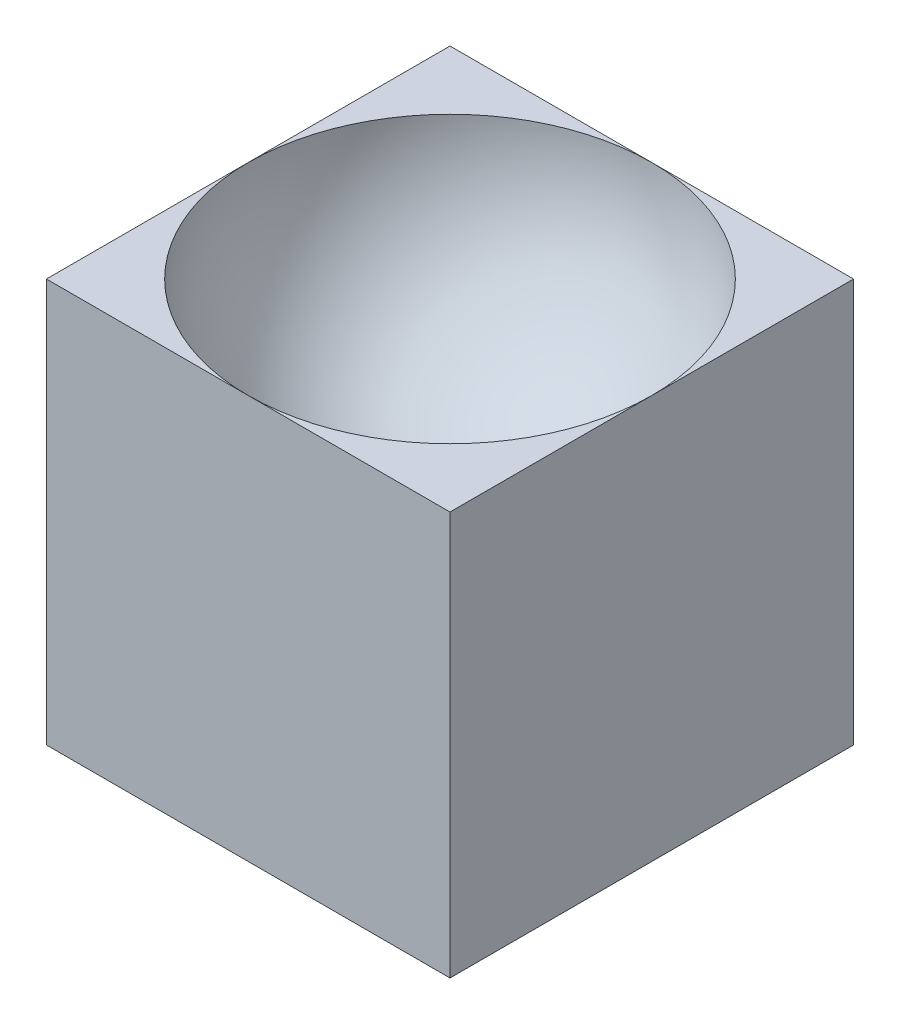
ISO-10303-21;
HEADER;
FILE_DESCRIPTION(('STEP AP214'),'2;1');
FILE_NAME('part.step','',(''),(''),'','','');
FILE_SCHEMA(('AUTOMOTIVE_DESIGN { 1 0 10303 214 1 1 1 1 }'));
ENDSEC;
DATA;
#1=APPLICATION_CONTEXT('core data for automotive mechanical design processes');
#2=APPLICATION_PROTOCOL_DEFINITION('international standard','automotive_design',2000,#1);
#3=PRODUCT_CONTEXT('',#1,'mechanical');
#4=PRODUCT('Part','Part','',(#3));
#5=PRODUCT_RELATED_PRODUCT_CATEGORY('part','',(#4));
#6=PRODUCT_DEFINITION_FORMATION('','',#4);
#7=PRODUCT_DEFINITION_CONTEXT('part definition',#1,'design');
#8=PRODUCT_DEFINITION('design','',#6,#7);
#9=PRODUCT_DEFINITION_SHAPE('','',#8);
#10=(LENGTH_UNIT() NAMED_UNIT(*) SI_UNIT(.MILLI.,.METRE.));
#11=(NAMED_UNIT(*) PLANE_ANGLE_UNIT() SI_UNIT($,.RADIAN.));
#12=(NAMED_UNIT(*) SI_UNIT($,.STERADIAN.) SOLID_ANGLE_UNIT());
#13=UNCERTAINTY_MEASURE_WITH_UNIT(LENGTH_MEASURE(1.E-05),#10,'distance_accuracy_value','');
#14=(GEOMETRIC_REPRESENTATION_CONTEXT(3) GLOBAL_UNCERTAINTY_ASSIGNED_CONTEXT((#13)) GLOBAL_UNIT_ASSIGNED_CONTEXT((#10,
#11,#12)) REPRESENTATION_CONTEXT('',''));
#15=CARTESIAN_POINT('',(0.,0.,0.));
#16=DIRECTION('',(0.,0.,1.));
#17=DIRECTION('',(1.,0.,0.));
#18=AXIS2_PLACEMENT_3D('',#15,#16,#17);
#19=CARTESIAN_POINT('',(0.,2.,0.));
#20=DIRECTION('',(0.,1.,0.));
#21=DIRECTION('',(0.,0.,1.));
#22=AXIS2_PLACEMENT_3D('',#19,#20,#21);
#23=PLANE('',#22);
#24=DIRECTION('',(1.,0.,0.));
#25=VECTOR('',#24,1.);
#26=CARTESIAN_POINT('',(-1.,2.,1.));
#27=LINE('',#26,#25);
#28=CARTESIAN_POINT('',(-1.,2.,1.));
#29=VERTEX_POINT('',#28);
#30=CARTESIAN_POINT('',(0.,2.,1.));
#31=VERTEX_POINT('',#30);
#32=EDGE_CURVE('E119',#29,#31,#27,.T.);
#33=ORIENTED_EDGE('',*,*,#32,.T.);
#34=CARTESIAN_POINT('',(0.,2.,0.));
#35=DIRECTION('',(0.,1.,0.));
#36=DIRECTION('',(0.,0.,1.));
#37=AXIS2_PLACEMENT_3D('',#34,#35,#36);
#38=CIRCLE('',#37,1.);
#39=CARTESIAN_POINT('',(-1.,2.,0.));
#40=VERTEX_POINT('',#39);
#41=EDGE_CURVE('E11',#31,#40,#38,.F.);
#42=ORIENTED_EDGE('',*,*,#41,.T.);
#43=DIRECTION('',(0.,0.,1.));
#44=VECTOR('',#43,1.);
#45=CARTESIAN_POINT('',(-1.,2.,-1.));
#46=LINE('',#45,#44);
#47=EDGE_CURVE('E115',#40,#29,#46,.T.);
#48=ORIENTED_EDGE('',*,*,#47,.T.);
#49=EDGE_LOOP('',(#33,#42,#48));
#50=FACE_BOUND('',#49,.T.);
#51=ADVANCED_FACE('F37',(#50),#23,.T.);
#52=CARTESIAN_POINT('',(-1.,2.,-1.));
#53=VERTEX_POINT('',#52);
#54=EDGE_CURVE('E116',#53,#40,#46,.T.);
#55=ORIENTED_EDGE('',*,*,#54,.T.);
#56=CARTESIAN_POINT('',(0.,2.,-1.));
#57=VERTEX_POINT('',#56);
#58=EDGE_CURVE('E46',#40,#57,#38,.F.);
#59=ORIENTED_EDGE('',*,*,#58,.T.);
#60=DIRECTION('',(-1.,0.,0.));
#61=VECTOR('',#60,1.);
#62=CARTESIAN_POINT('',(-1.,2.,-1.));
#63=LINE('',#62,#61);
#64=EDGE_CURVE('E112',#57,#53,#63,.T.);
#65=ORIENTED_EDGE('',*,*,#64,.T.);
#66=EDGE_LOOP('',(#55,#59,#65));
#67=FACE_BOUND('',#66,.T.);
#68=ADVANCED_FACE('F152',(#67),#23,.T.);
#69=CARTESIAN_POINT('',(1.,2.,-1.));
#70=VERTEX_POINT('',#69);
#71=EDGE_CURVE('E103',#70,#57,#63,.T.);
#72=ORIENTED_EDGE('',*,*,#71,.T.);
#73=CARTESIAN_POINT('',(1.,2.,0.));
#74=VERTEX_POINT('',#73);
#75=EDGE_CURVE('E99',#57,#74,#38,.F.);
#76=ORIENTED_EDGE('',*,*,#75,.T.);
#77=DIRECTION('',(0.,0.,-1.));
#78=VECTOR('',#77,1.);
#79=CARTESIAN_POINT('',(1.,2.,-1.));
#80=LINE('',#79,#78);
#81=EDGE_CURVE('E89',#74,#70,#80,.T.);
#82=ORIENTED_EDGE('',*,*,#81,.T.);
#83=EDGE_LOOP('',(#72,#76,#82));
#84=FACE_BOUND('',#83,.T.);
#85=ADVANCED_FACE('F102',(#84),#23,.T.);
#86=CARTESIAN_POINT('',(1.,2.,-1.));
#87=DIRECTION('',(-1.,0.,0.));
#88=DIRECTION('',(0.,0.,1.));
#89=AXIS2_PLACEMENT_3D('',#86,#87,#88);
#90=PLANE('',#89);
#91=DIRECTION('',(0.,0.,-1.));
#92=VECTOR('',#91,1.);
#93=CARTESIAN_POINT('',(1.,0.,-1.));
#94=LINE('',#93,#92);
#95=CARTESIAN_POINT('',(1.,0.,1.));
#96=VERTEX_POINT('',#95);
#97=CARTESIAN_POINT('',(1.,0.,-1.));
#98=VERTEX_POINT('',#97);
#99=EDGE_CURVE('E123',#96,#98,#94,.T.);
#100=ORIENTED_EDGE('',*,*,#99,.T.);
#101=DIRECTION('',(0.,-1.,0.));
#102=VECTOR('',#101,1.);
#103=CARTESIAN_POINT('',(1.,2.,-1.));
#104=LINE('',#103,#102);
#105=EDGE_CURVE('E101',#70,#98,#104,.T.);
#106=ORIENTED_EDGE('',*,*,#105,.F.);
#107=ORIENTED_EDGE('',*,*,#81,.F.);
#108=CARTESIAN_POINT('',(1.,2.,1.));
#109=VERTEX_POINT('',#108);
#110=EDGE_CURVE('E108',#109,#74,#80,.T.);
#111=ORIENTED_EDGE('',*,*,#110,.F.);
#112=DIRECTION('',(0.,-1.,0.));
#113=VECTOR('',#112,1.);
#114=CARTESIAN_POINT('',(1.,2.,1.));
#115=LINE('',#114,#113);
#116=EDGE_CURVE('E122',#109,#96,#115,.T.);
#117=ORIENTED_EDGE('',*,*,#116,.T.);
#118=EDGE_LOOP('',(#100,#106,#107,#111,#117));
#119=FACE_BOUND('',#118,.T.);
#120=ADVANCED_FACE('F39',(#119),#90,.F.);
#121=CARTESIAN_POINT('',(-1.,2.,-1.));
#122=DIRECTION('',(0.,0.,1.));
#123=DIRECTION('',(1.,0.,0.));
#124=AXIS2_PLACEMENT_3D('',#121,#122,#123);
#125=PLANE('',#124);
#126=DIRECTION('',(-1.,0.,0.));
#127=VECTOR('',#126,1.);
#128=CARTESIAN_POINT('',(-1.,0.,-1.));
#129=LINE('',#128,#127);
#130=CARTESIAN_POINT('',(-1.,0.,-1.));
#131=VERTEX_POINT('',#130);
#132=EDGE_CURVE('E125',#98,#131,#129,.T.);
#133=ORIENTED_EDGE('',*,*,#132,.T.);
#134=DIRECTION('',(0.,-1.,0.));
#135=VECTOR('',#134,1.);
#136=CARTESIAN_POINT('',(-1.,2.,-1.));
#137=LINE('',#136,#135);
#138=EDGE_CURVE('E133',#53,#131,#137,.T.);
#139=ORIENTED_EDGE('',*,*,#138,.F.);
#140=ORIENTED_EDGE('',*,*,#64,.F.);
#141=ORIENTED_EDGE('',*,*,#71,.F.);
#142=ORIENTED_EDGE('',*,*,#105,.T.);
#143=EDGE_LOOP('',(#133,#139,#140,#141,#142));
#144=FACE_BOUND('',#143,.T.);
#145=ADVANCED_FACE('F136',(#144),#125,.F.);
#146=CARTESIAN_POINT('',(-1.,2.,-1.));
#147=DIRECTION('',(1.,0.,0.));
#148=DIRECTION('',(0.,0.,-1.));
#149=AXIS2_PLACEMENT_3D('',#146,#147,#148);
#150=PLANE('',#149);
#151=DIRECTION('',(0.,0.,1.));
#152=VECTOR('',#151,1.);
#153=CARTESIAN_POINT('',(-1.,0.,-1.));
#154=LINE('',#153,#152);
#155=CARTESIAN_POINT('',(-1.,0.,1.));
#156=VERTEX_POINT('',#155);
#157=EDGE_CURVE('E127',#131,#156,#154,.T.);
#158=ORIENTED_EDGE('',*,*,#157,.T.);
#159=DIRECTION('',(0.,-1.,0.));
#160=VECTOR('',#159,1.);
#161=CARTESIAN_POINT('',(-1.,2.,1.));
#162=LINE('',#161,#160);
#163=EDGE_CURVE('E131',#29,#156,#162,.T.);
#164=ORIENTED_EDGE('',*,*,#163,.F.);
#165=ORIENTED_EDGE('',*,*,#47,.F.);
#166=ORIENTED_EDGE('',*,*,#54,.F.);
#167=ORIENTED_EDGE('',*,*,#138,.T.);
#168=EDGE_LOOP('',(#158,#164,#165,#166,#167));
#169=FACE_BOUND('',#168,.T.);
#170=ADVANCED_FACE('F145',(#169),#150,.F.);
#171=CARTESIAN_POINT('',(-1.,2.,1.));
#172=DIRECTION('',(0.,0.,-1.));
#173=DIRECTION('',(-1.,0.,0.));
#174=AXIS2_PLACEMENT_3D('',#171,#172,#173);
#175=PLANE('',#174);
#176=DIRECTION('',(1.,0.,0.));
#177=VECTOR('',#176,1.);
#178=CARTESIAN_POINT('',(-1.,0.,1.));
#179=LINE('',#178,#177);
#180=EDGE_CURVE('E81',#156,#96,#179,.T.);
#181=ORIENTED_EDGE('',*,*,#180,.T.);
#182=ORIENTED_EDGE('',*,*,#116,.F.);
#183=EDGE_CURVE('E59',#31,#109,#27,.T.);
#184=ORIENTED_EDGE('',*,*,#183,.F.);
#185=ORIENTED_EDGE('',*,*,#32,.F.);
#186=ORIENTED_EDGE('',*,*,#163,.T.);
#187=EDGE_LOOP('',(#181,#182,#184,#185,#186));
#188=FACE_BOUND('',#187,.T.);
#189=ADVANCED_FACE('F149',(#188),#175,.F.);
#190=ORIENTED_EDGE('',*,*,#110,.T.);
#191=EDGE_CURVE('E41',#74,#31,#38,.F.);
#192=ORIENTED_EDGE('',*,*,#191,.T.);
#193=ORIENTED_EDGE('',*,*,#183,.T.);
#194=EDGE_LOOP('',(#190,#192,#193));
#195=FACE_BOUND('',#194,.T.);
#196=ADVANCED_FACE('F111',(#195),#23,.T.);
#197=CARTESIAN_POINT('',(0.,0.,0.));
#198=DIRECTION('',(0.,1.,0.));
#199=DIRECTION('',(0.,0.,1.));
#200=AXIS2_PLACEMENT_3D('',#197,#198,#199);
#201=PLANE('',#200);
#202=ORIENTED_EDGE('',*,*,#99,.F.);
#203=ORIENTED_EDGE('',*,*,#180,.F.);
#204=ORIENTED_EDGE('',*,*,#157,.F.);
#205=ORIENTED_EDGE('',*,*,#132,.F.);
#206=EDGE_LOOP('',(#202,#203,#204,#205));
#207=FACE_BOUND('',#206,.T.);
#208=ADVANCED_FACE('F141',(#207),#201,.F.);
#209=CARTESIAN_POINT('',(0.,2.,0.));
#210=DIRECTION('',(0.,0.,1.));
#211=DIRECTION('',(1.,0.,0.));
#212=AXIS2_PLACEMENT_3D('',#209,#210,#211);
#213=SPHERICAL_SURFACE('',#212,1.);
#214=CARTESIAN_POINT('',(0.,2.,0.));
#215=DIRECTION('',(0.,1.,0.));
#216=DIRECTION('',(0.,0.,1.));
#217=AXIS2_PLACEMENT_3D('',#214,#215,#216);
#218=SPHERICAL_SURFACE('',#217,1.);
#219=ORIENTED_EDGE('',*,*,#191,.F.);
#220=ORIENTED_EDGE('',*,*,#75,.F.);
#221=ORIENTED_EDGE('',*,*,#58,.F.);
#222=ORIENTED_EDGE('',*,*,#41,.F.);
#223=EDGE_LOOP('',(#219,#220,#221,#222));
#224=FACE_BOUND('',#223,.T.);
#225=ADVANCED_FACE('F98',(#224),#218,.F.);
#226=CLOSED_SHELL('',(#51,#68,#85,#120,#145,#170,#189,#196,#208,#225));
#227=MANIFOLD_SOLID_BREP('B2',#226);
#228=ADVANCED_BREP_SHAPE_REPRESENTATION('',(#18,#227),#14);
#229=SHAPE_DEFINITION_REPRESENTATION(#9,#228);
ENDSEC;
END-ISO-10303-21;
